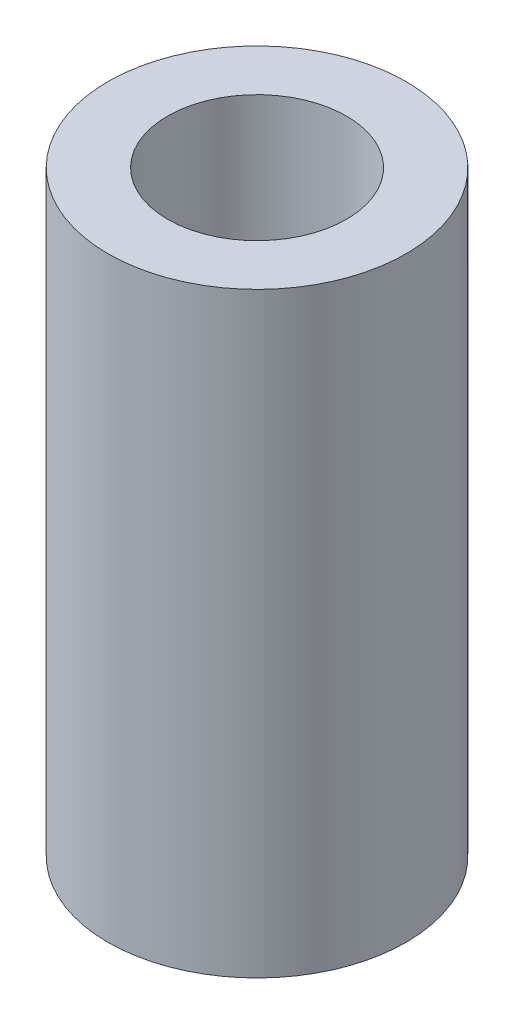
ISO-10303-21;
HEADER;
FILE_DESCRIPTION(('STEP AP214'),'2;1');
FILE_NAME('part.step','',(''),(''),'','','');
FILE_SCHEMA(('AUTOMOTIVE_DESIGN { 1 0 10303 214 1 1 1 1 }'));
ENDSEC;
DATA;
#1=APPLICATION_CONTEXT('core data for automotive mechanical design processes');
#2=APPLICATION_PROTOCOL_DEFINITION('international standard','automotive_design',2000,#1);
#3=PRODUCT_CONTEXT('',#1,'mechanical');
#4=PRODUCT('Part','Part','',(#3));
#5=PRODUCT_RELATED_PRODUCT_CATEGORY('part','',(#4));
#6=PRODUCT_DEFINITION_FORMATION('','',#4);
#7=PRODUCT_DEFINITION_CONTEXT('part definition',#1,'design');
#8=PRODUCT_DEFINITION('design','',#6,#7);
#9=PRODUCT_DEFINITION_SHAPE('','',#8);
#10=(LENGTH_UNIT() NAMED_UNIT(*) SI_UNIT(.MILLI.,.METRE.));
#11=(NAMED_UNIT(*) PLANE_ANGLE_UNIT() SI_UNIT($,.RADIAN.));
#12=(NAMED_UNIT(*) SI_UNIT($,.STERADIAN.) SOLID_ANGLE_UNIT());
#13=UNCERTAINTY_MEASURE_WITH_UNIT(LENGTH_MEASURE(1.E-05),#10,'distance_accuracy_value','');
#14=(GEOMETRIC_REPRESENTATION_CONTEXT(3) GLOBAL_UNCERTAINTY_ASSIGNED_CONTEXT((#13)) GLOBAL_UNIT_ASSIGNED_CONTEXT((#10,
#11,#12)) REPRESENTATION_CONTEXT('',''));
#15=CARTESIAN_POINT('',(0.,0.,0.));
#16=DIRECTION('',(0.,0.,1.));
#17=DIRECTION('',(1.,0.,0.));
#18=AXIS2_PLACEMENT_3D('',#15,#16,#17);
#19=CARTESIAN_POINT('',(-4.18712531967016,8.,-0.837425063934032));
#20=DIRECTION('',(0.,1.,0.));
#21=DIRECTION('',(0.,0.,1.));
#22=AXIS2_PLACEMENT_3D('',#19,#20,#21);
#23=PLANE('',#22);
#24=CARTESIAN_POINT('',(-4.18712531967016,8.,-0.837425063934032));
#25=DIRECTION('',(0.,1.,0.));
#26=DIRECTION('',(0.,0.,1.));
#27=AXIS2_PLACEMENT_3D('',#24,#25,#26);
#28=CIRCLE('',#27,2.);
#29=CARTESIAN_POINT('',(-4.18712531967016,8.,1.16257493606597));
#30=VERTEX_POINT('',#29);
#31=EDGE_CURVE('E10',#30,#30,#28,.T.);
#32=ORIENTED_EDGE('',*,*,#31,.T.);
#33=EDGE_LOOP('',(#32));
#34=FACE_BOUND('',#33,.T.);
#35=CARTESIAN_POINT('',(-4.18712531967016,8.,-0.837425063934032));
#36=DIRECTION('',(0.,1.,0.));
#37=DIRECTION('',(0.,0.,1.));
#38=AXIS2_PLACEMENT_3D('',#35,#36,#37);
#39=CIRCLE('',#38,1.2);
#40=CARTESIAN_POINT('',(-4.18712531967016,8.,0.362574936065967));
#41=VERTEX_POINT('',#40);
#42=EDGE_CURVE('E41',#41,#41,#39,.T.);
#43=ORIENTED_EDGE('',*,*,#42,.F.);
#44=EDGE_LOOP('',(#43));
#45=FACE_BOUND('',#44,.T.);
#46=ADVANCED_FACE('F30',(#34,#45),#23,.T.);
#47=CARTESIAN_POINT('',(-4.18712531967016,0.,-0.837425063934032));
#48=DIRECTION('',(0.,1.,0.));
#49=DIRECTION('',(0.,0.,1.));
#50=AXIS2_PLACEMENT_3D('',#47,#48,#49);
#51=PLANE('',#50);
#52=CARTESIAN_POINT('',(-4.18712531967016,0.,-0.837425063934032));
#53=DIRECTION('',(0.,1.,0.));
#54=DIRECTION('',(0.,0.,1.));
#55=AXIS2_PLACEMENT_3D('',#52,#53,#54);
#56=CIRCLE('',#55,2.);
#57=CARTESIAN_POINT('',(-4.18712531967016,0.,1.16257493606597));
#58=VERTEX_POINT('',#57);
#59=EDGE_CURVE('E34',#58,#58,#56,.T.);
#60=ORIENTED_EDGE('',*,*,#59,.F.);
#61=EDGE_LOOP('',(#60));
#62=FACE_BOUND('',#61,.T.);
#63=CARTESIAN_POINT('',(-4.18712531967016,0.,-0.837425063934032));
#64=DIRECTION('',(0.,1.,0.));
#65=DIRECTION('',(0.,0.,1.));
#66=AXIS2_PLACEMENT_3D('',#63,#64,#65);
#67=CIRCLE('',#66,1.2);
#68=CARTESIAN_POINT('',(-4.18712531967016,0.,0.362574936065967));
#69=VERTEX_POINT('',#68);
#70=EDGE_CURVE('E43',#69,#69,#67,.T.);
#71=ORIENTED_EDGE('',*,*,#70,.T.);
#72=EDGE_LOOP('',(#71));
#73=FACE_BOUND('',#72,.T.);
#74=ADVANCED_FACE('F53',(#62,#73),#51,.F.);
#75=CARTESIAN_POINT('',(-4.18712531967016,8.,-0.837425063934032));
#76=DIRECTION('',(0.,-1.,0.));
#77=DIRECTION('',(0.,0.,-1.));
#78=AXIS2_PLACEMENT_3D('',#75,#76,#77);
#79=CYLINDRICAL_SURFACE('',#78,2.);
#80=ORIENTED_EDGE('',*,*,#31,.F.);
#81=EDGE_LOOP('',(#80));
#82=FACE_BOUND('',#81,.T.);
#83=ORIENTED_EDGE('',*,*,#59,.T.);
#84=EDGE_LOOP('',(#83));
#85=FACE_BOUND('',#84,.T.);
#86=ADVANCED_FACE('F32',(#82,#85),#79,.T.);
#87=CARTESIAN_POINT('',(-4.18712531967016,8.,-0.837425063934032));
#88=DIRECTION('',(0.,-1.,0.));
#89=DIRECTION('',(0.,0.,-1.));
#90=AXIS2_PLACEMENT_3D('',#87,#88,#89);
#91=CYLINDRICAL_SURFACE('',#90,1.2);
#92=ORIENTED_EDGE('',*,*,#42,.T.);
#93=EDGE_LOOP('',(#92));
#94=FACE_BOUND('',#93,.T.);
#95=ORIENTED_EDGE('',*,*,#70,.F.);
#96=EDGE_LOOP('',(#95));
#97=FACE_BOUND('',#96,.T.);
#98=ADVANCED_FACE('F49',(#94,#97),#91,.F.);
#99=CLOSED_SHELL('',(#46,#74,#86,#98));
#100=MANIFOLD_SOLID_BREP('B2',#99);
#101=ADVANCED_BREP_SHAPE_REPRESENTATION('',(#18,#100),#14);
#102=SHAPE_DEFINITION_REPRESENTATION(#9,#101);
ENDSEC;
END-ISO-10303-21;
